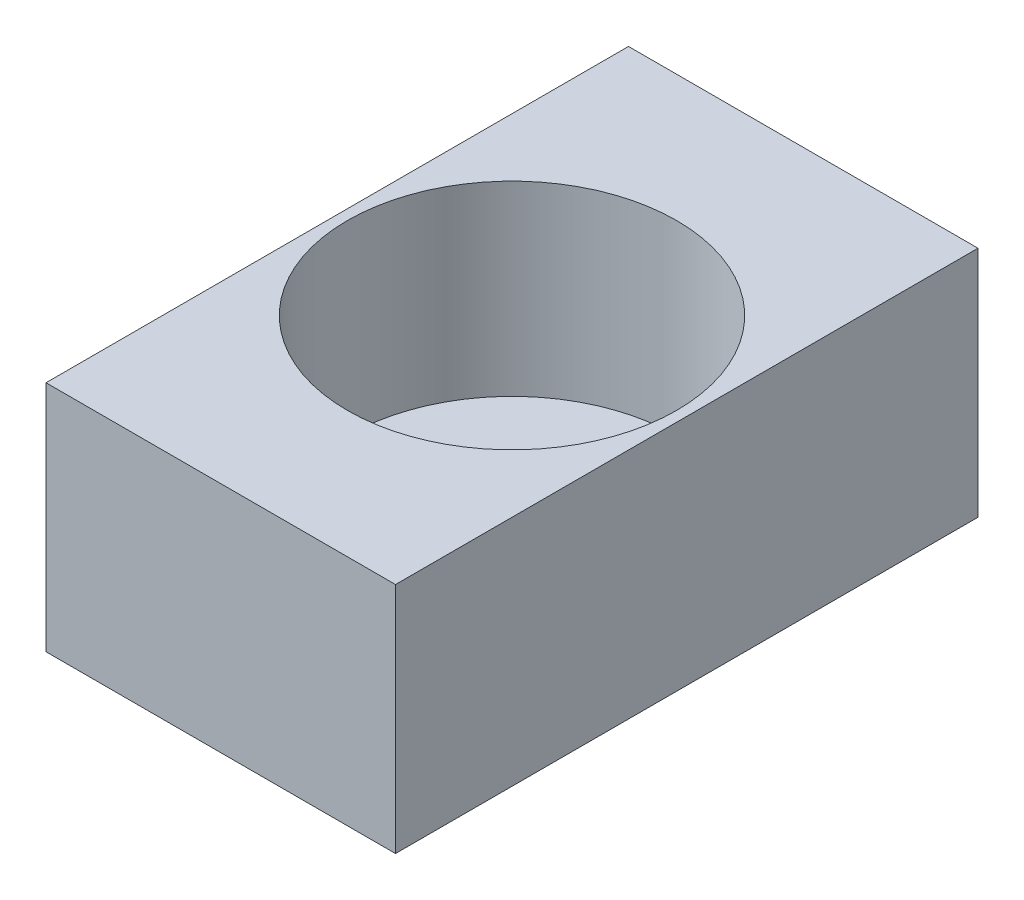
ISO-10303-21;
HEADER;
FILE_DESCRIPTION(('STEP AP214'),'2;1');
FILE_NAME('part.step','',(''),(''),'','','');
FILE_SCHEMA(('AUTOMOTIVE_DESIGN { 1 0 10303 214 1 1 1 1 }'));
ENDSEC;
DATA;
#1=APPLICATION_CONTEXT('core data for automotive mechanical design processes');
#2=APPLICATION_PROTOCOL_DEFINITION('international standard','automotive_design',2000,#1);
#3=PRODUCT_CONTEXT('',#1,'mechanical');
#4=PRODUCT('Part','Part','',(#3));
#5=PRODUCT_RELATED_PRODUCT_CATEGORY('part','',(#4));
#6=PRODUCT_DEFINITION_FORMATION('','',#4);
#7=PRODUCT_DEFINITION_CONTEXT('part definition',#1,'design');
#8=PRODUCT_DEFINITION('design','',#6,#7);
#9=PRODUCT_DEFINITION_SHAPE('','',#8);
#10=(LENGTH_UNIT() NAMED_UNIT(*) SI_UNIT(.MILLI.,.METRE.));
#11=(NAMED_UNIT(*) PLANE_ANGLE_UNIT() SI_UNIT($,.RADIAN.));
#12=(NAMED_UNIT(*) SI_UNIT($,.STERADIAN.) SOLID_ANGLE_UNIT());
#13=UNCERTAINTY_MEASURE_WITH_UNIT(LENGTH_MEASURE(1.E-05),#10,'distance_accuracy_value','');
#14=(GEOMETRIC_REPRESENTATION_CONTEXT(3) GLOBAL_UNCERTAINTY_ASSIGNED_CONTEXT((#13)) GLOBAL_UNIT_ASSIGNED_CONTEXT((#10,
#11,#12)) REPRESENTATION_CONTEXT('',''));
#15=CARTESIAN_POINT('',(0.,0.,0.));
#16=DIRECTION('',(0.,0.,1.));
#17=DIRECTION('',(1.,0.,0.));
#18=AXIS2_PLACEMENT_3D('',#15,#16,#17);
#19=CARTESIAN_POINT('',(0.,0.,50.));
#20=DIRECTION('',(1.,0.,0.));
#21=DIRECTION('',(0.,0.,-1.));
#22=AXIS2_PLACEMENT_3D('',#19,#20,#21);
#23=PLANE('',#22);
#24=DIRECTION('',(0.,-1.,0.));
#25=VECTOR('',#24,1.);
#26=CARTESIAN_POINT('',(0.,0.,0.));
#27=LINE('',#26,#25);
#28=CARTESIAN_POINT('',(0.,20.,0.));
#29=VERTEX_POINT('',#28);
#30=CARTESIAN_POINT('',(0.,0.,0.));
#31=VERTEX_POINT('',#30);
#32=EDGE_CURVE('E102',#29,#31,#27,.T.);
#33=ORIENTED_EDGE('',*,*,#32,.T.);
#34=DIRECTION('',(0.,0.,-1.));
#35=VECTOR('',#34,1.);
#36=CARTESIAN_POINT('',(0.,0.,50.));
#37=LINE('',#36,#35);
#38=CARTESIAN_POINT('',(0.,0.,50.));
#39=VERTEX_POINT('',#38);
#40=EDGE_CURVE('E11',#39,#31,#37,.T.);
#41=ORIENTED_EDGE('',*,*,#40,.F.);
#42=DIRECTION('',(0.,-1.,0.));
#43=VECTOR('',#42,1.);
#44=CARTESIAN_POINT('',(0.,0.,50.));
#45=LINE('',#44,#43);
#46=CARTESIAN_POINT('',(0.,20.,50.));
#47=VERTEX_POINT('',#46);
#48=EDGE_CURVE('E93',#47,#39,#45,.T.);
#49=ORIENTED_EDGE('',*,*,#48,.F.);
#50=DIRECTION('',(0.,0.,-1.));
#51=VECTOR('',#50,1.);
#52=CARTESIAN_POINT('',(0.,20.,50.));
#53=LINE('',#52,#51);
#54=EDGE_CURVE('E99',#47,#29,#53,.T.);
#55=ORIENTED_EDGE('',*,*,#54,.T.);
#56=EDGE_LOOP('',(#33,#41,#49,#55));
#57=FACE_BOUND('',#56,.T.);
#58=ADVANCED_FACE('F39',(#57),#23,.F.);
#59=CARTESIAN_POINT('',(0.,0.,50.));
#60=DIRECTION('',(0.,1.,0.));
#61=DIRECTION('',(0.,0.,1.));
#62=AXIS2_PLACEMENT_3D('',#59,#60,#61);
#63=PLANE('',#62);
#64=CARTESIAN_POINT('',(15.,0.,25.));
#65=DIRECTION('',(0.,1.,0.));
#66=DIRECTION('',(0.,0.,1.));
#67=AXIS2_PLACEMENT_3D('',#64,#65,#66);
#68=CIRCLE('',#67,3.25);
#69=CARTESIAN_POINT('',(15.,0.,28.25));
#70=VERTEX_POINT('',#69);
#71=EDGE_CURVE('E45',#70,#70,#68,.T.);
#72=ORIENTED_EDGE('',*,*,#71,.T.);
#73=EDGE_LOOP('',(#72));
#74=FACE_BOUND('',#73,.T.);
#75=DIRECTION('',(1.,0.,0.));
#76=VECTOR('',#75,1.);
#77=CARTESIAN_POINT('',(0.,0.,0.));
#78=LINE('',#77,#76);
#79=CARTESIAN_POINT('',(30.,0.,0.));
#80=VERTEX_POINT('',#79);
#81=EDGE_CURVE('E92',#31,#80,#78,.T.);
#82=ORIENTED_EDGE('',*,*,#81,.T.);
#83=DIRECTION('',(0.,0.,-1.));
#84=VECTOR('',#83,1.);
#85=CARTESIAN_POINT('',(30.,0.,50.));
#86=LINE('',#85,#84);
#87=CARTESIAN_POINT('',(30.,0.,50.));
#88=VERTEX_POINT('',#87);
#89=EDGE_CURVE('E48',#88,#80,#86,.T.);
#90=ORIENTED_EDGE('',*,*,#89,.F.);
#91=DIRECTION('',(1.,0.,0.));
#92=VECTOR('',#91,1.);
#93=CARTESIAN_POINT('',(0.,0.,50.));
#94=LINE('',#93,#92);
#95=EDGE_CURVE('E88',#39,#88,#94,.T.);
#96=ORIENTED_EDGE('',*,*,#95,.F.);
#97=ORIENTED_EDGE('',*,*,#40,.T.);
#98=EDGE_LOOP('',(#82,#90,#96,#97));
#99=FACE_BOUND('',#98,.T.);
#100=ADVANCED_FACE('F94',(#74,#99),#63,.F.);
#101=CARTESIAN_POINT('',(30.,0.,50.));
#102=DIRECTION('',(-1.,0.,0.));
#103=DIRECTION('',(0.,0.,1.));
#104=AXIS2_PLACEMENT_3D('',#101,#102,#103);
#105=PLANE('',#104);
#106=DIRECTION('',(0.,1.,0.));
#107=VECTOR('',#106,1.);
#108=CARTESIAN_POINT('',(30.,0.,0.));
#109=LINE('',#108,#107);
#110=CARTESIAN_POINT('',(30.,20.,0.));
#111=VERTEX_POINT('',#110);
#112=EDGE_CURVE('E71',#80,#111,#109,.T.);
#113=ORIENTED_EDGE('',*,*,#112,.T.);
#114=DIRECTION('',(0.,0.,-1.));
#115=VECTOR('',#114,1.);
#116=CARTESIAN_POINT('',(30.,20.,50.));
#117=LINE('',#116,#115);
#118=CARTESIAN_POINT('',(30.,20.,50.));
#119=VERTEX_POINT('',#118);
#120=EDGE_CURVE('E96',#119,#111,#117,.T.);
#121=ORIENTED_EDGE('',*,*,#120,.F.);
#122=DIRECTION('',(0.,1.,0.));
#123=VECTOR('',#122,1.);
#124=CARTESIAN_POINT('',(30.,0.,50.));
#125=LINE('',#124,#123);
#126=EDGE_CURVE('E90',#88,#119,#125,.T.);
#127=ORIENTED_EDGE('',*,*,#126,.F.);
#128=ORIENTED_EDGE('',*,*,#89,.T.);
#129=EDGE_LOOP('',(#113,#121,#127,#128));
#130=FACE_BOUND('',#129,.T.);
#131=ADVANCED_FACE('F98',(#130),#105,.F.);
#132=CARTESIAN_POINT('',(0.,20.,50.));
#133=DIRECTION('',(0.,-1.,0.));
#134=DIRECTION('',(0.,0.,-1.));
#135=AXIS2_PLACEMENT_3D('',#132,#133,#134);
#136=PLANE('',#135);
#137=CARTESIAN_POINT('',(15.,20.,25.));
#138=DIRECTION('',(0.,1.,0.));
#139=DIRECTION('',(0.,0.,1.));
#140=AXIS2_PLACEMENT_3D('',#137,#138,#139);
#141=CIRCLE('',#140,14.125);
#142=CARTESIAN_POINT('',(15.,20.,39.125));
#143=VERTEX_POINT('',#142);
#144=EDGE_CURVE('E117',#143,#143,#141,.T.);
#145=ORIENTED_EDGE('',*,*,#144,.F.);
#146=EDGE_LOOP('',(#145));
#147=FACE_BOUND('',#146,.T.);
#148=DIRECTION('',(-1.,0.,0.));
#149=VECTOR('',#148,1.);
#150=CARTESIAN_POINT('',(0.,20.,0.));
#151=LINE('',#150,#149);
#152=EDGE_CURVE('E80',#111,#29,#151,.T.);
#153=ORIENTED_EDGE('',*,*,#152,.T.);
#154=ORIENTED_EDGE('',*,*,#54,.F.);
#155=DIRECTION('',(-1.,0.,0.));
#156=VECTOR('',#155,1.);
#157=CARTESIAN_POINT('',(0.,20.,50.));
#158=LINE('',#157,#156);
#159=EDGE_CURVE('E57',#119,#47,#158,.T.);
#160=ORIENTED_EDGE('',*,*,#159,.F.);
#161=ORIENTED_EDGE('',*,*,#120,.T.);
#162=EDGE_LOOP('',(#153,#154,#160,#161));
#163=FACE_BOUND('',#162,.T.);
#164=ADVANCED_FACE('F115',(#147,#163),#136,.F.);
#165=CARTESIAN_POINT('',(0.,0.,50.));
#166=DIRECTION('',(0.,0.,-1.));
#167=DIRECTION('',(-1.,0.,0.));
#168=AXIS2_PLACEMENT_3D('',#165,#166,#167);
#169=PLANE('',#168);
#170=ORIENTED_EDGE('',*,*,#48,.T.);
#171=ORIENTED_EDGE('',*,*,#95,.T.);
#172=ORIENTED_EDGE('',*,*,#126,.T.);
#173=ORIENTED_EDGE('',*,*,#159,.T.);
#174=EDGE_LOOP('',(#170,#171,#172,#173));
#175=FACE_BOUND('',#174,.T.);
#176=ADVANCED_FACE('F87',(#175),#169,.F.);
#177=CARTESIAN_POINT('',(0.,0.,0.));
#178=DIRECTION('',(0.,0.,-1.));
#179=DIRECTION('',(-1.,0.,0.));
#180=AXIS2_PLACEMENT_3D('',#177,#178,#179);
#181=PLANE('',#180);
#182=ORIENTED_EDGE('',*,*,#32,.F.);
#183=ORIENTED_EDGE('',*,*,#152,.F.);
#184=ORIENTED_EDGE('',*,*,#112,.F.);
#185=ORIENTED_EDGE('',*,*,#81,.F.);
#186=EDGE_LOOP('',(#182,#183,#184,#185));
#187=FACE_BOUND('',#186,.T.);
#188=ADVANCED_FACE('F113',(#187),#181,.T.);
#189=CARTESIAN_POINT('',(15.,4.,25.));
#190=DIRECTION('',(0.,1.,0.));
#191=DIRECTION('',(0.,0.,1.));
#192=AXIS2_PLACEMENT_3D('',#189,#190,#191);
#193=CYLINDRICAL_SURFACE('',#192,14.125);
#194=CARTESIAN_POINT('',(15.,4.,25.));
#195=DIRECTION('',(0.,1.,0.));
#196=DIRECTION('',(0.,0.,1.));
#197=AXIS2_PLACEMENT_3D('',#194,#195,#196);
#198=CIRCLE('',#197,14.125);
#199=CARTESIAN_POINT('',(15.,4.,39.125));
#200=VERTEX_POINT('',#199);
#201=EDGE_CURVE('E110',#200,#200,#198,.T.);
#202=ORIENTED_EDGE('',*,*,#201,.F.);
#203=EDGE_LOOP('',(#202));
#204=FACE_BOUND('',#203,.T.);
#205=ORIENTED_EDGE('',*,*,#144,.T.);
#206=EDGE_LOOP('',(#205));
#207=FACE_BOUND('',#206,.T.);
#208=ADVANCED_FACE('F140',(#204,#207),#193,.F.);
#209=CARTESIAN_POINT('',(15.,4.,25.));
#210=DIRECTION('',(0.,1.,0.));
#211=DIRECTION('',(0.,0.,1.));
#212=AXIS2_PLACEMENT_3D('',#209,#210,#211);
#213=PLANE('',#212);
#214=CARTESIAN_POINT('',(15.,4.,25.));
#215=DIRECTION('',(0.,1.,0.));
#216=DIRECTION('',(0.,0.,1.));
#217=AXIS2_PLACEMENT_3D('',#214,#215,#216);
#218=CIRCLE('',#217,3.25);
#219=CARTESIAN_POINT('',(15.,4.,28.25));
#220=VERTEX_POINT('',#219);
#221=EDGE_CURVE('E125',#220,#220,#218,.T.);
#222=ORIENTED_EDGE('',*,*,#221,.F.);
#223=EDGE_LOOP('',(#222));
#224=FACE_BOUND('',#223,.T.);
#225=ORIENTED_EDGE('',*,*,#201,.T.);
#226=EDGE_LOOP('',(#225));
#227=FACE_BOUND('',#226,.T.);
#228=ADVANCED_FACE('F132',(#224,#227),#213,.T.);
#229=CARTESIAN_POINT('',(15.,-12.,25.));
#230=DIRECTION('',(0.,1.,0.));
#231=DIRECTION('',(0.,0.,1.));
#232=AXIS2_PLACEMENT_3D('',#229,#230,#231);
#233=CYLINDRICAL_SURFACE('',#232,3.25);
#234=ORIENTED_EDGE('',*,*,#221,.T.);
#235=EDGE_LOOP('',(#234));
#236=FACE_BOUND('',#235,.T.);
#237=ORIENTED_EDGE('',*,*,#71,.F.);
#238=EDGE_LOOP('',(#237));
#239=FACE_BOUND('',#238,.T.);
#240=ADVANCED_FACE('F133',(#236,#239),#233,.F.);
#241=CLOSED_SHELL('',(#58,#100,#131,#164,#176,#188,#208,#228,#240));
#242=MANIFOLD_SOLID_BREP('B2',#241);
#243=ADVANCED_BREP_SHAPE_REPRESENTATION('',(#18,#242),#14);
#244=SHAPE_DEFINITION_REPRESENTATION(#9,#243);
ENDSEC;
END-ISO-10303-21;
